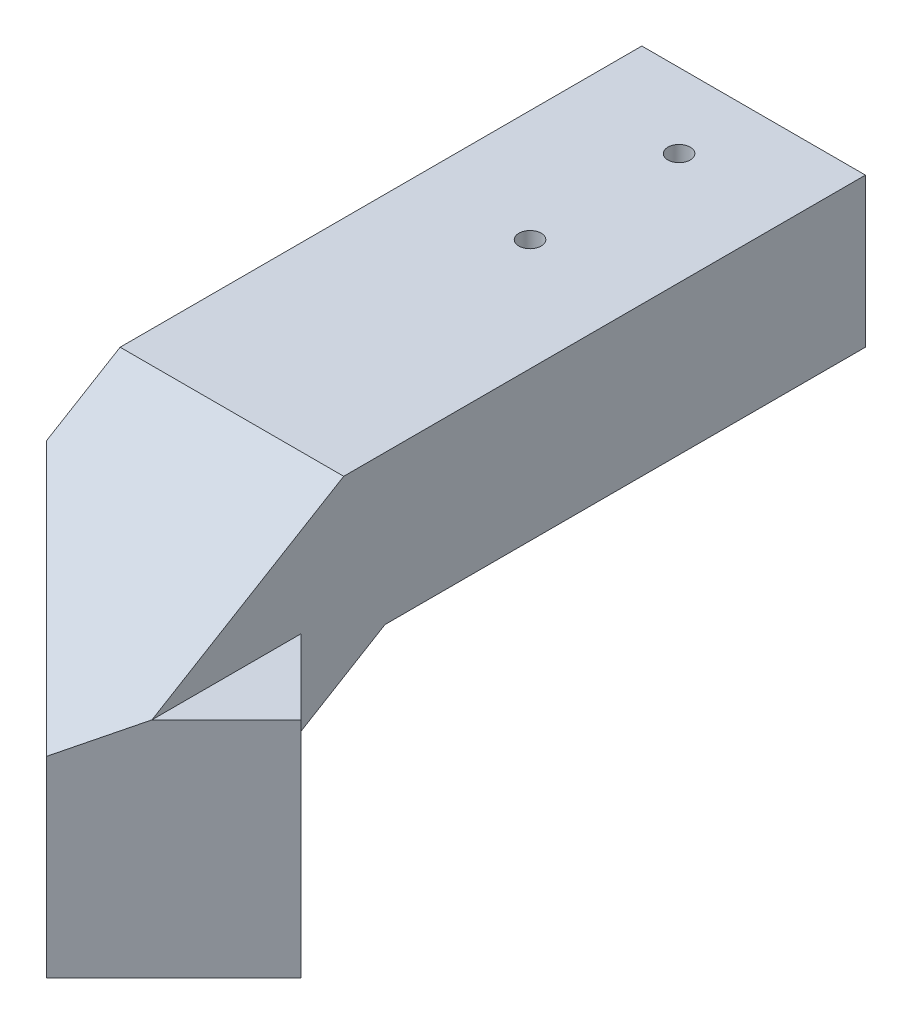
ISO-10303-21;
HEADER;
FILE_DESCRIPTION(('STEP AP214'),'2;1');
FILE_NAME('part.step','',(''),(''),'','','');
FILE_SCHEMA(('AUTOMOTIVE_DESIGN { 1 0 10303 214 1 1 1 1 }'));
ENDSEC;
DATA;
#1=APPLICATION_CONTEXT('core data for automotive mechanical design processes');
#2=APPLICATION_PROTOCOL_DEFINITION('international standard','automotive_design',2000,#1);
#3=PRODUCT_CONTEXT('',#1,'mechanical');
#4=PRODUCT('Part','Part','',(#3));
#5=PRODUCT_RELATED_PRODUCT_CATEGORY('part','',(#4));
#6=PRODUCT_DEFINITION_FORMATION('','',#4);
#7=PRODUCT_DEFINITION_CONTEXT('part definition',#1,'design');
#8=PRODUCT_DEFINITION('design','',#6,#7);
#9=PRODUCT_DEFINITION_SHAPE('','',#8);
#10=(LENGTH_UNIT() NAMED_UNIT(*) SI_UNIT(.MILLI.,.METRE.));
#11=(NAMED_UNIT(*) PLANE_ANGLE_UNIT() SI_UNIT($,.RADIAN.));
#12=(NAMED_UNIT(*) SI_UNIT($,.STERADIAN.) SOLID_ANGLE_UNIT());
#13=UNCERTAINTY_MEASURE_WITH_UNIT(LENGTH_MEASURE(1.E-05),#10,'distance_accuracy_value','');
#14=(GEOMETRIC_REPRESENTATION_CONTEXT(3) GLOBAL_UNCERTAINTY_ASSIGNED_CONTEXT((#13)) GLOBAL_UNIT_ASSIGNED_CONTEXT((#10,
#11,#12)) REPRESENTATION_CONTEXT('',''));
#15=CARTESIAN_POINT('',(0.,0.,0.));
#16=DIRECTION('',(0.,0.,1.));
#17=DIRECTION('',(1.,0.,0.));
#18=AXIS2_PLACEMENT_3D('',#15,#16,#17);
#19=CARTESIAN_POINT('',(30.,0.,0.));
#20=DIRECTION('',(0.,-1.,0.));
#21=DIRECTION('',(0.,0.,-1.));
#22=AXIS2_PLACEMENT_3D('',#19,#20,#21);
#23=PLANE('',#22);
#24=CARTESIAN_POINT('',(15.,0.,9.99999999999999));
#25=DIRECTION('',(0.,-1.,0.));
#26=DIRECTION('',(0.,0.,-1.));
#27=AXIS2_PLACEMENT_3D('',#24,#25,#26);
#28=CIRCLE('',#27,1.5);
#29=CARTESIAN_POINT('',(15.,0.,8.49999999999999));
#30=VERTEX_POINT('',#29);
#31=EDGE_CURVE('E263',#30,#30,#28,.T.);
#32=ORIENTED_EDGE('',*,*,#31,.T.);
#33=EDGE_LOOP('',(#32));
#34=FACE_BOUND('',#33,.T.);
#35=CARTESIAN_POINT('',(15.,0.,-10.));
#36=DIRECTION('',(0.,-1.,0.));
#37=DIRECTION('',(0.,0.,-1.));
#38=AXIS2_PLACEMENT_3D('',#35,#36,#37);
#39=CIRCLE('',#38,1.5);
#40=CARTESIAN_POINT('',(15.,0.,-11.5));
#41=VERTEX_POINT('',#40);
#42=EDGE_CURVE('E144',#41,#41,#39,.T.);
#43=ORIENTED_EDGE('',*,*,#42,.T.);
#44=EDGE_LOOP('',(#43));
#45=FACE_BOUND('',#44,.T.);
#46=DIRECTION('',(0.,0.,1.));
#47=VECTOR('',#46,1.);
#48=CARTESIAN_POINT('',(0.,0.,0.));
#49=LINE('',#48,#47);
#50=CARTESIAN_POINT('',(0.,0.,-20.));
#51=VERTEX_POINT('',#50);
#52=CARTESIAN_POINT('',(0.,0.,50.));
#53=VERTEX_POINT('',#52);
#54=EDGE_CURVE('E134',#51,#53,#49,.T.);
#55=ORIENTED_EDGE('',*,*,#54,.T.);
#56=DIRECTION('',(-1.,0.,0.));
#57=VECTOR('',#56,1.);
#58=CARTESIAN_POINT('',(30.,0.,50.));
#59=LINE('',#58,#57);
#60=CARTESIAN_POINT('',(30.,0.,50.));
#61=VERTEX_POINT('',#60);
#62=EDGE_CURVE('E219',#61,#53,#59,.T.);
#63=ORIENTED_EDGE('',*,*,#62,.F.);
#64=DIRECTION('',(0.,0.,1.));
#65=VECTOR('',#64,1.);
#66=CARTESIAN_POINT('',(30.,0.,0.));
#67=LINE('',#66,#65);
#68=CARTESIAN_POINT('',(30.,0.,-20.));
#69=VERTEX_POINT('',#68);
#70=EDGE_CURVE('E127',#69,#61,#67,.T.);
#71=ORIENTED_EDGE('',*,*,#70,.F.);
#72=DIRECTION('',(1.,0.,0.));
#73=VECTOR('',#72,1.);
#74=CARTESIAN_POINT('',(0.,0.,-20.));
#75=LINE('',#74,#73);
#76=EDGE_CURVE('E138',#51,#69,#75,.T.);
#77=ORIENTED_EDGE('',*,*,#76,.F.);
#78=EDGE_LOOP('',(#55,#63,#71,#77));
#79=FACE_BOUND('',#78,.T.);
#80=ADVANCED_FACE('F33',(#34,#45,#79),#23,.F.);
#81=CARTESIAN_POINT('',(30.,0.,50.));
#82=DIRECTION('',(0.,-0.857492925712545,-0.514495755427526));
#83=DIRECTION('',(0.,0.514495755427526,-0.857492925712545));
#84=AXIS2_PLACEMENT_3D('',#81,#82,#83);
#85=PLANE('',#84);
#86=ORIENTED_EDGE('',*,*,#62,.T.);
#87=DIRECTION('',(0.,0.514495755427526,-0.857492925712544));
#88=VECTOR('',#87,1.);
#89=CARTESIAN_POINT('',(0.,22.0588235294118,13.235294117647));
#90=LINE('',#89,#88);
#91=CARTESIAN_POINT('',(0.,-5.92015403706431,59.8669233951072));
#92=VERTEX_POINT('',#91);
#93=EDGE_CURVE('E46',#92,#53,#90,.T.);
#94=ORIENTED_EDGE('',*,*,#93,.F.);
#95=DIRECTION('',(0.650944554904118,-0.390566732942472,0.650944554904121));
#96=VECTOR('',#95,1.);
#97=CARTESIAN_POINT('',(-26.8724643293838,10.203324560566,32.9944590657233));
#98=LINE('',#97,#96);
#99=CARTESIAN_POINT('',(22.9289321881345,-19.6775133499451,82.7958555832418));
#100=VERTEX_POINT('',#99);
#101=EDGE_CURVE('E11',#92,#100,#98,.T.);
#102=ORIENTED_EDGE('',*,*,#101,.T.);
#103=DIRECTION('',(0.650944554904121,0.390566732942471,-0.650944554904118));
#104=VECTOR('',#103,1.);
#105=CARTESIAN_POINT('',(30.8474576271187,-14.9263980865546,74.8773301442577));
#106=LINE('',#105,#104);
#107=CARTESIAN_POINT('',(30.,-15.4348726628258,75.7247877713763));
#108=VERTEX_POINT('',#107);
#109=EDGE_CURVE('E153',#100,#108,#106,.T.);
#110=ORIENTED_EDGE('',*,*,#109,.T.);
#111=DIRECTION('',(0.,-0.514495755427526,0.857492925712544));
#112=VECTOR('',#111,1.);
#113=CARTESIAN_POINT('',(30.,0.,50.));
#114=LINE('',#113,#112);
#115=EDGE_CURVE('E209',#61,#108,#114,.T.);
#116=ORIENTED_EDGE('',*,*,#115,.F.);
#117=EDGE_LOOP('',(#86,#94,#102,#110,#116));
#118=FACE_BOUND('',#117,.T.);
#119=ADVANCED_FACE('F250',(#118),#85,.F.);
#120=CARTESIAN_POINT('',(30.,-45.4348726628258,75.7247877713763));
#121=DIRECTION('',(0.,1.,0.));
#122=DIRECTION('',(0.,0.,1.));
#123=AXIS2_PLACEMENT_3D('',#120,#121,#122);
#124=PLANE('',#123);
#125=DIRECTION('',(-0.707106781186549,0.,0.707106781186546));
#126=VECTOR('',#125,1.);
#127=CARTESIAN_POINT('',(40.,-45.4348726628258,65.7247877713764));
#128=LINE('',#127,#126);
#129=CARTESIAN_POINT('',(40.,-45.4348726628258,65.7247877713764));
#130=VERTEX_POINT('',#129);
#131=CARTESIAN_POINT('',(22.9289321881345,-45.4348726628258,82.7958555832418));
#132=VERTEX_POINT('',#131);
#133=EDGE_CURVE('E192',#130,#132,#128,.T.);
#134=ORIENTED_EDGE('',*,*,#133,.T.);
#135=DIRECTION('',(0.707106781186546,0.,0.707106781186549));
#136=VECTOR('',#135,1.);
#137=CARTESIAN_POINT('',(2.9289321881346,-45.4348726628258,62.7958555832418));
#138=LINE('',#137,#136);
#139=CARTESIAN_POINT('',(2.9289321881346,-45.4348726628258,62.7958555832418));
#140=VERTEX_POINT('',#139);
#141=EDGE_CURVE('E168',#140,#132,#138,.T.);
#142=ORIENTED_EDGE('',*,*,#141,.F.);
#143=DIRECTION('',(-0.707106781186549,0.,0.707106781186546));
#144=VECTOR('',#143,1.);
#145=CARTESIAN_POINT('',(20.0000000000001,-45.4348726628258,45.7247877713764));
#146=LINE('',#145,#144);
#147=CARTESIAN_POINT('',(20.0000000000001,-45.4348726628258,45.7247877713764));
#148=VERTEX_POINT('',#147);
#149=EDGE_CURVE('E187',#148,#140,#146,.T.);
#150=ORIENTED_EDGE('',*,*,#149,.F.);
#151=DIRECTION('',(0.707106781186546,0.,0.707106781186549));
#152=VECTOR('',#151,1.);
#153=CARTESIAN_POINT('',(20.0000000000001,-45.4348726628258,45.7247877713764));
#154=LINE('',#153,#152);
#155=EDGE_CURVE('E179',#148,#130,#154,.T.);
#156=ORIENTED_EDGE('',*,*,#155,.T.);
#157=EDGE_LOOP('',(#134,#142,#150,#156));
#158=FACE_BOUND('',#157,.T.);
#159=ADVANCED_FACE('F235',(#158),#124,.F.);
#160=CARTESIAN_POINT('',(30.,-20.,44.4603207010313));
#161=DIRECTION('',(0.,0.857492925712544,0.514495755427526));
#162=DIRECTION('',(0.,-0.514495755427526,0.857492925712545));
#163=AXIS2_PLACEMENT_3D('',#160,#161,#162);
#164=PLANE('',#163);
#165=DIRECTION('',(-0.650944554904118,0.390566732942472,-0.650944554904121));
#166=VECTOR('',#165,1.);
#167=CARTESIAN_POINT('',(23.5086121967503,-22.8638475602572,49.2333999681267));
#168=LINE('',#167,#166);
#169=CARTESIAN_POINT('',(30.,-26.758680242207,55.7247877713763));
#170=VERTEX_POINT('',#169);
#171=CARTESIAN_POINT('',(20.0000000000001,-20.758680242207,45.7247877713764));
#172=VERTEX_POINT('',#171);
#173=EDGE_CURVE('E197',#170,#172,#168,.T.);
#174=ORIENTED_EDGE('',*,*,#173,.T.);
#175=DIRECTION('',(-0.650944554904121,-0.390566732942471,0.650944554904118));
#176=VECTOR('',#175,1.);
#177=CARTESIAN_POINT('',(24.9659640744362,-17.7791017975454,40.7588236969403));
#178=LINE('',#177,#176);
#179=CARTESIAN_POINT('',(10.0000000000001,-26.758680242207,55.7247877713763));
#180=VERTEX_POINT('',#179);
#181=EDGE_CURVE('E202',#172,#180,#178,.T.);
#182=ORIENTED_EDGE('',*,*,#181,.T.);
#183=DIRECTION('',(-0.650944554904118,0.390566732942472,-0.650944554904121));
#184=VECTOR('',#183,1.);
#185=CARTESIAN_POINT('',(11.9831884679368,-27.948593322969,57.7079762393131));
#186=LINE('',#185,#184);
#187=CARTESIAN_POINT('',(0.,-20.7586802422069,45.7247877713762));
#188=VERTEX_POINT('',#187);
#189=EDGE_CURVE('E205',#180,#188,#186,.T.);
#190=ORIENTED_EDGE('',*,*,#189,.T.);
#191=DIRECTION('',(0.,0.514495755427526,-0.857492925712544));
#192=VECTOR('',#191,1.);
#193=CARTESIAN_POINT('',(0.,-20.,44.4603207010313));
#194=LINE('',#193,#192);
#195=CARTESIAN_POINT('',(0.,-20.,44.4603207010313));
#196=VERTEX_POINT('',#195);
#197=EDGE_CURVE('E128',#188,#196,#194,.T.);
#198=ORIENTED_EDGE('',*,*,#197,.T.);
#199=DIRECTION('',(-1.,0.,0.));
#200=VECTOR('',#199,1.);
#201=CARTESIAN_POINT('',(30.,-20.,44.4603207010313));
#202=LINE('',#201,#200);
#203=CARTESIAN_POINT('',(30.,-20.,44.4603207010313));
#204=VERTEX_POINT('',#203);
#205=EDGE_CURVE('E126',#204,#196,#202,.T.);
#206=ORIENTED_EDGE('',*,*,#205,.F.);
#207=DIRECTION('',(0.,0.514495755427526,-0.857492925712544));
#208=VECTOR('',#207,1.);
#209=CARTESIAN_POINT('',(30.,-20.,44.4603207010313));
#210=LINE('',#209,#208);
#211=EDGE_CURVE('E212',#170,#204,#210,.T.);
#212=ORIENTED_EDGE('',*,*,#211,.F.);
#213=EDGE_LOOP('',(#174,#182,#190,#198,#206,#212));
#214=FACE_BOUND('',#213,.T.);
#215=ADVANCED_FACE('F282',(#214),#164,.F.);
#216=CARTESIAN_POINT('',(30.,-20.,0.));
#217=DIRECTION('',(0.,1.,0.));
#218=DIRECTION('',(0.,0.,1.));
#219=AXIS2_PLACEMENT_3D('',#216,#217,#218);
#220=PLANE('',#219);
#221=CARTESIAN_POINT('',(15.,-20.,9.99999999999999));
#222=DIRECTION('',(0.,-1.,0.));
#223=DIRECTION('',(0.,0.,-1.));
#224=AXIS2_PLACEMENT_3D('',#221,#222,#223);
#225=CIRCLE('',#224,1.5);
#226=CARTESIAN_POINT('',(15.,-20.,8.49999999999999));
#227=VERTEX_POINT('',#226);
#228=EDGE_CURVE('E274',#227,#227,#225,.T.);
#229=ORIENTED_EDGE('',*,*,#228,.F.);
#230=EDGE_LOOP('',(#229));
#231=FACE_BOUND('',#230,.T.);
#232=CARTESIAN_POINT('',(15.,-20.,-10.));
#233=DIRECTION('',(0.,-1.,0.));
#234=DIRECTION('',(0.,0.,-1.));
#235=AXIS2_PLACEMENT_3D('',#232,#233,#234);
#236=CIRCLE('',#235,1.5);
#237=CARTESIAN_POINT('',(15.,-20.,-11.5));
#238=VERTEX_POINT('',#237);
#239=EDGE_CURVE('E147',#238,#238,#236,.T.);
#240=ORIENTED_EDGE('',*,*,#239,.F.);
#241=EDGE_LOOP('',(#240));
#242=FACE_BOUND('',#241,.T.);
#243=DIRECTION('',(0.,0.,-1.));
#244=VECTOR('',#243,1.);
#245=CARTESIAN_POINT('',(0.,-20.,0.));
#246=LINE('',#245,#244);
#247=CARTESIAN_POINT('',(0.,-20.,-20.));
#248=VERTEX_POINT('',#247);
#249=EDGE_CURVE('E119',#196,#248,#246,.T.);
#250=ORIENTED_EDGE('',*,*,#249,.T.);
#251=DIRECTION('',(-1.,0.,0.));
#252=VECTOR('',#251,1.);
#253=CARTESIAN_POINT('',(30.,-20.,-20.));
#254=LINE('',#253,#252);
#255=CARTESIAN_POINT('',(30.,-20.,-20.));
#256=VERTEX_POINT('',#255);
#257=EDGE_CURVE('E124',#256,#248,#254,.T.);
#258=ORIENTED_EDGE('',*,*,#257,.F.);
#259=DIRECTION('',(0.,0.,-1.));
#260=VECTOR('',#259,1.);
#261=CARTESIAN_POINT('',(30.,-20.,0.));
#262=LINE('',#261,#260);
#263=EDGE_CURVE('E214',#204,#256,#262,.T.);
#264=ORIENTED_EDGE('',*,*,#263,.F.);
#265=ORIENTED_EDGE('',*,*,#205,.T.);
#266=EDGE_LOOP('',(#250,#258,#264,#265));
#267=FACE_BOUND('',#266,.T.);
#268=ADVANCED_FACE('F121',(#231,#242,#267),#220,.F.);
#269=CARTESIAN_POINT('',(30.,0.,0.));
#270=DIRECTION('',(1.,0.,0.));
#271=DIRECTION('',(0.,0.,-1.));
#272=AXIS2_PLACEMENT_3D('',#269,#270,#271);
#273=PLANE('',#272);
#274=DIRECTION('',(0.,0.,1.));
#275=VECTOR('',#274,1.);
#276=CARTESIAN_POINT('',(30.,-15.4348726628258,0.));
#277=LINE('',#276,#275);
#278=CARTESIAN_POINT('',(30.,-15.4348726628258,55.7247877713763));
#279=VERTEX_POINT('',#278);
#280=EDGE_CURVE('E199',#279,#108,#277,.T.);
#281=ORIENTED_EDGE('',*,*,#280,.F.);
#282=DIRECTION('',(0.,1.,0.));
#283=VECTOR('',#282,1.);
#284=CARTESIAN_POINT('',(30.,0.,55.7247877713763));
#285=LINE('',#284,#283);
#286=EDGE_CURVE('E191',#170,#279,#285,.T.);
#287=ORIENTED_EDGE('',*,*,#286,.F.);
#288=ORIENTED_EDGE('',*,*,#211,.T.);
#289=ORIENTED_EDGE('',*,*,#263,.T.);
#290=DIRECTION('',(0.,-1.,0.));
#291=VECTOR('',#290,1.);
#292=CARTESIAN_POINT('',(30.,0.,-20.));
#293=LINE('',#292,#291);
#294=EDGE_CURVE('E143',#69,#256,#293,.T.);
#295=ORIENTED_EDGE('',*,*,#294,.F.);
#296=ORIENTED_EDGE('',*,*,#70,.T.);
#297=ORIENTED_EDGE('',*,*,#115,.T.);
#298=EDGE_LOOP('',(#281,#287,#288,#289,#295,#296,#297));
#299=FACE_BOUND('',#298,.T.);
#300=ADVANCED_FACE('F252',(#299),#273,.T.);
#301=CARTESIAN_POINT('',(0.,0.,0.));
#302=DIRECTION('',(1.,0.,0.));
#303=DIRECTION('',(0.,0.,-1.));
#304=AXIS2_PLACEMENT_3D('',#301,#302,#303);
#305=PLANE('',#304);
#306=DIRECTION('',(0.,1.,0.));
#307=VECTOR('',#306,1.);
#308=CARTESIAN_POINT('',(0.,0.,59.8669233951072));
#309=LINE('',#308,#307);
#310=CARTESIAN_POINT('',(0.,-25.0013209293262,59.8669233951072));
#311=VERTEX_POINT('',#310);
#312=EDGE_CURVE('E40',#311,#92,#309,.T.);
#313=ORIENTED_EDGE('',*,*,#312,.T.);
#314=ORIENTED_EDGE('',*,*,#93,.T.);
#315=ORIENTED_EDGE('',*,*,#54,.F.);
#316=DIRECTION('',(0.,1.,0.));
#317=VECTOR('',#316,1.);
#318=CARTESIAN_POINT('',(0.,-20.,-20.));
#319=LINE('',#318,#317);
#320=EDGE_CURVE('E131',#248,#51,#319,.T.);
#321=ORIENTED_EDGE('',*,*,#320,.F.);
#322=ORIENTED_EDGE('',*,*,#249,.F.);
#323=ORIENTED_EDGE('',*,*,#197,.F.);
#324=DIRECTION('',(0.,0.287347885566346,-0.957826285221151));
#325=VECTOR('',#324,1.);
#326=CARTESIAN_POINT('',(0.,-22.7048456950139,52.2120059473996));
#327=LINE('',#326,#325);
#328=EDGE_CURVE('E54',#311,#188,#327,.T.);
#329=ORIENTED_EDGE('',*,*,#328,.F.);
#330=EDGE_LOOP('',(#313,#314,#315,#321,#322,#323,#329));
#331=FACE_BOUND('',#330,.T.);
#332=ADVANCED_FACE('F132',(#331),#305,.F.);
#333=CARTESIAN_POINT('',(20.0000000000001,-45.4348726628258,45.7247877713764));
#334=DIRECTION('',(-0.707106781186546,0.,-0.707106781186549));
#335=DIRECTION('',(-0.707106781186549,0.,0.707106781186546));
#336=AXIS2_PLACEMENT_3D('',#333,#334,#335);
#337=PLANE('',#336);
#338=ORIENTED_EDGE('',*,*,#181,.F.);
#339=DIRECTION('',(0.,-1.,0.));
#340=VECTOR('',#339,1.);
#341=CARTESIAN_POINT('',(20.0000000000001,-45.4348726628258,45.7247877713764));
#342=LINE('',#341,#340);
#343=EDGE_CURVE('E177',#172,#148,#342,.T.);
#344=ORIENTED_EDGE('',*,*,#343,.T.);
#345=ORIENTED_EDGE('',*,*,#149,.T.);
#346=DIRECTION('',(0.,-1.,0.));
#347=VECTOR('',#346,1.);
#348=CARTESIAN_POINT('',(2.9289321881346,-26.758680242207,62.7958555832418));
#349=LINE('',#348,#347);
#350=CARTESIAN_POINT('',(2.9289321881346,-26.758680242207,62.7958555832418));
#351=VERTEX_POINT('',#350);
#352=EDGE_CURVE('E165',#351,#140,#349,.T.);
#353=ORIENTED_EDGE('',*,*,#352,.F.);
#354=DIRECTION('',(0.707106781186549,0.,-0.707106781186546));
#355=VECTOR('',#354,1.);
#356=CARTESIAN_POINT('',(2.9289321881346,-26.758680242207,62.7958555832418));
#357=LINE('',#356,#355);
#358=EDGE_CURVE('E174',#351,#180,#357,.T.);
#359=ORIENTED_EDGE('',*,*,#358,.T.);
#360=EDGE_LOOP('',(#338,#344,#345,#353,#359));
#361=FACE_BOUND('',#360,.T.);
#362=ADVANCED_FACE('F230',(#361),#337,.T.);
#363=CARTESIAN_POINT('',(-12.8623938856881,0.,12.862393885688));
#364=DIRECTION('',(0.707106781186549,0.,-0.707106781186546));
#365=DIRECTION('',(-0.707106781186546,0.,-0.707106781186549));
#366=AXIS2_PLACEMENT_3D('',#363,#364,#365);
#367=PLANE('',#366);
#368=CARTESIAN_POINT('',(30.,-35.4348726628258,55.7247877713764));
#369=DIRECTION('',(0.707106781186549,0.,-0.707106781186546));
#370=DIRECTION('',(-0.707106781186546,0.,-0.707106781186549));
#371=AXIS2_PLACEMENT_3D('',#368,#369,#370);
#372=CIRCLE('',#371,3.00000000000001);
#373=CARTESIAN_POINT('',(27.8786796564404,-35.4348726628258,53.6034674278167));
#374=VERTEX_POINT('',#373);
#375=EDGE_CURVE('E159',#374,#374,#372,.T.);
#376=ORIENTED_EDGE('',*,*,#375,.F.);
#377=EDGE_LOOP('',(#376));
#378=FACE_BOUND('',#377,.T.);
#379=ORIENTED_EDGE('',*,*,#173,.F.);
#380=ORIENTED_EDGE('',*,*,#286,.T.);
#381=DIRECTION('',(-0.707106781186546,0.,-0.707106781186549));
#382=VECTOR('',#381,1.);
#383=CARTESIAN_POINT('',(20.0000000000001,-15.4348726628258,45.7247877713764));
#384=LINE('',#383,#382);
#385=CARTESIAN_POINT('',(40.,-15.4348726628258,65.7247877713764));
#386=VERTEX_POINT('',#385);
#387=EDGE_CURVE('E184',#386,#279,#384,.T.);
#388=ORIENTED_EDGE('',*,*,#387,.F.);
#389=DIRECTION('',(0.,1.,0.));
#390=VECTOR('',#389,1.);
#391=CARTESIAN_POINT('',(40.,-45.4348726628258,65.7247877713764));
#392=LINE('',#391,#390);
#393=EDGE_CURVE('E181',#130,#386,#392,.T.);
#394=ORIENTED_EDGE('',*,*,#393,.F.);
#395=ORIENTED_EDGE('',*,*,#155,.F.);
#396=ORIENTED_EDGE('',*,*,#343,.F.);
#397=EDGE_LOOP('',(#379,#380,#388,#394,#395,#396));
#398=FACE_BOUND('',#397,.T.);
#399=ADVANCED_FACE('F245',(#378,#398),#367,.T.);
#400=CARTESIAN_POINT('',(20.0000000000001,-15.4348726628258,45.7247877713764));
#401=DIRECTION('',(0.,1.,0.));
#402=DIRECTION('',(0.,0.,1.));
#403=AXIS2_PLACEMENT_3D('',#400,#401,#402);
#404=PLANE('',#403);
#405=ORIENTED_EDGE('',*,*,#387,.T.);
#406=ORIENTED_EDGE('',*,*,#280,.T.);
#407=DIRECTION('',(-0.707106781186549,0.,0.707106781186546));
#408=VECTOR('',#407,1.);
#409=CARTESIAN_POINT('',(40.,-15.4348726628258,65.7247877713764));
#410=LINE('',#409,#408);
#411=EDGE_CURVE('E188',#386,#108,#410,.T.);
#412=ORIENTED_EDGE('',*,*,#411,.F.);
#413=EDGE_LOOP('',(#405,#406,#412));
#414=FACE_BOUND('',#413,.T.);
#415=ADVANCED_FACE('F248',(#414),#404,.T.);
#416=CARTESIAN_POINT('',(40.,-45.4348726628258,65.7247877713764));
#417=DIRECTION('',(0.707106781186546,0.,0.707106781186549));
#418=DIRECTION('',(0.707106781186549,0.,-0.707106781186546));
#419=AXIS2_PLACEMENT_3D('',#416,#417,#418);
#420=PLANE('',#419);
#421=ORIENTED_EDGE('',*,*,#109,.F.);
#422=DIRECTION('',(0.,1.,0.));
#423=VECTOR('',#422,1.);
#424=CARTESIAN_POINT('',(22.9289321881345,-45.4348726628258,82.7958555832418));
#425=LINE('',#424,#423);
#426=EDGE_CURVE('E171',#132,#100,#425,.T.);
#427=ORIENTED_EDGE('',*,*,#426,.F.);
#428=ORIENTED_EDGE('',*,*,#133,.F.);
#429=ORIENTED_EDGE('',*,*,#393,.T.);
#430=ORIENTED_EDGE('',*,*,#411,.T.);
#431=EDGE_LOOP('',(#421,#427,#428,#429,#430));
#432=FACE_BOUND('',#431,.T.);
#433=ADVANCED_FACE('F241',(#432),#420,.T.);
#434=CARTESIAN_POINT('',(-7.07106781186549,-20.7586802422069,52.7958555832417));
#435=DIRECTION('',(0.276172385369497,0.920574617898323,0.276172385369498));
#436=DIRECTION('',(0.,-0.287347885566346,0.957826285221151));
#437=AXIS2_PLACEMENT_3D('',#434,#435,#436);
#438=PLANE('',#437);
#439=DIRECTION('',(0.650944554904118,-0.390566732942472,0.65094455490412));
#440=VECTOR('',#439,1.);
#441=CARTESIAN_POINT('',(-7.07106781186549,-20.7586802422069,52.7958555832417));
#442=LINE('',#441,#440);
#443=EDGE_CURVE('E163',#311,#351,#442,.T.);
#444=ORIENTED_EDGE('',*,*,#443,.F.);
#445=ORIENTED_EDGE('',*,*,#328,.T.);
#446=ORIENTED_EDGE('',*,*,#189,.F.);
#447=ORIENTED_EDGE('',*,*,#358,.F.);
#448=EDGE_LOOP('',(#444,#445,#446,#447));
#449=FACE_BOUND('',#448,.T.);
#450=ADVANCED_FACE('F226',(#449),#438,.F.);
#451=CARTESIAN_POINT('',(-29.9334616975536,0.,29.9334616975535));
#452=DIRECTION('',(-0.707106781186549,0.,0.707106781186546));
#453=DIRECTION('',(0.707106781186546,0.,0.707106781186549));
#454=AXIS2_PLACEMENT_3D('',#451,#452,#453);
#455=PLANE('',#454);
#456=ORIENTED_EDGE('',*,*,#101,.F.);
#457=ORIENTED_EDGE('',*,*,#312,.F.);
#458=ORIENTED_EDGE('',*,*,#443,.T.);
#459=ORIENTED_EDGE('',*,*,#352,.T.);
#460=ORIENTED_EDGE('',*,*,#141,.T.);
#461=ORIENTED_EDGE('',*,*,#426,.T.);
#462=EDGE_LOOP('',(#456,#457,#458,#459,#460,#461));
#463=FACE_BOUND('',#462,.T.);
#464=CARTESIAN_POINT('',(12.9289321881345,-35.4348726628258,72.7958555832418));
#465=DIRECTION('',(-0.707106781186549,0.,0.707106781186546));
#466=DIRECTION('',(0.707106781186546,0.,0.707106781186549));
#467=AXIS2_PLACEMENT_3D('',#464,#465,#466);
#468=CIRCLE('',#467,3.00000000000001);
#469=CARTESIAN_POINT('',(15.0502525316942,-35.4348726628258,74.9171759268014));
#470=VERTEX_POINT('',#469);
#471=EDGE_CURVE('E156',#470,#470,#468,.T.);
#472=ORIENTED_EDGE('',*,*,#471,.F.);
#473=EDGE_LOOP('',(#472));
#474=FACE_BOUND('',#473,.T.);
#475=ADVANCED_FACE('F222',(#463,#474),#455,.T.);
#476=CARTESIAN_POINT('',(62.8623938856882,-35.4348726628258,22.8623938856883));
#477=DIRECTION('',(-0.707106781186549,0.,0.707106781186546));
#478=DIRECTION('',(0.707106781186546,0.,0.707106781186549));
#479=AXIS2_PLACEMENT_3D('',#476,#477,#478);
#480=CYLINDRICAL_SURFACE('',#479,3.00000000000001);
#481=ORIENTED_EDGE('',*,*,#375,.T.);
#482=EDGE_LOOP('',(#481));
#483=FACE_BOUND('',#482,.T.);
#484=ORIENTED_EDGE('',*,*,#471,.T.);
#485=EDGE_LOOP('',(#484));
#486=FACE_BOUND('',#485,.T.);
#487=ADVANCED_FACE('F337',(#483,#486),#480,.F.);
#488=CARTESIAN_POINT('',(0.,0.,-20.));
#489=DIRECTION('',(0.,0.,-1.));
#490=DIRECTION('',(-1.,0.,0.));
#491=AXIS2_PLACEMENT_3D('',#488,#489,#490);
#492=PLANE('',#491);
#493=ORIENTED_EDGE('',*,*,#257,.T.);
#494=ORIENTED_EDGE('',*,*,#320,.T.);
#495=ORIENTED_EDGE('',*,*,#76,.T.);
#496=ORIENTED_EDGE('',*,*,#294,.T.);
#497=EDGE_LOOP('',(#493,#494,#495,#496));
#498=FACE_BOUND('',#497,.T.);
#499=ADVANCED_FACE('F141',(#498),#492,.T.);
#500=CARTESIAN_POINT('',(15.,0.,-10.));
#501=DIRECTION('',(0.,-1.,0.));
#502=DIRECTION('',(0.,0.,-1.));
#503=AXIS2_PLACEMENT_3D('',#500,#501,#502);
#504=CYLINDRICAL_SURFACE('',#503,1.5);
#505=ORIENTED_EDGE('',*,*,#42,.F.);
#506=EDGE_LOOP('',(#505));
#507=FACE_BOUND('',#506,.T.);
#508=ORIENTED_EDGE('',*,*,#239,.T.);
#509=EDGE_LOOP('',(#508));
#510=FACE_BOUND('',#509,.T.);
#511=ADVANCED_FACE('F266',(#507,#510),#504,.F.);
#512=CARTESIAN_POINT('',(15.,0.,9.99999999999999));
#513=DIRECTION('',(0.,-1.,0.));
#514=DIRECTION('',(0.,0.,-1.));
#515=AXIS2_PLACEMENT_3D('',#512,#513,#514);
#516=CYLINDRICAL_SURFACE('',#515,1.5);
#517=ORIENTED_EDGE('',*,*,#31,.F.);
#518=EDGE_LOOP('',(#517));
#519=FACE_BOUND('',#518,.T.);
#520=ORIENTED_EDGE('',*,*,#228,.T.);
#521=EDGE_LOOP('',(#520));
#522=FACE_BOUND('',#521,.T.);
#523=ADVANCED_FACE('F269',(#519,#522),#516,.F.);
#524=CLOSED_SHELL('',(#80,#119,#159,#215,#268,#300,#332,#362,#399,#415,#433,#450,#475,#487,#499,
#511,#523));
#525=MANIFOLD_SOLID_BREP('B2',#524);
#526=ADVANCED_BREP_SHAPE_REPRESENTATION('',(#18,#525),#14);
#527=SHAPE_DEFINITION_REPRESENTATION(#9,#526);
ENDSEC;
END-ISO-10303-21;
